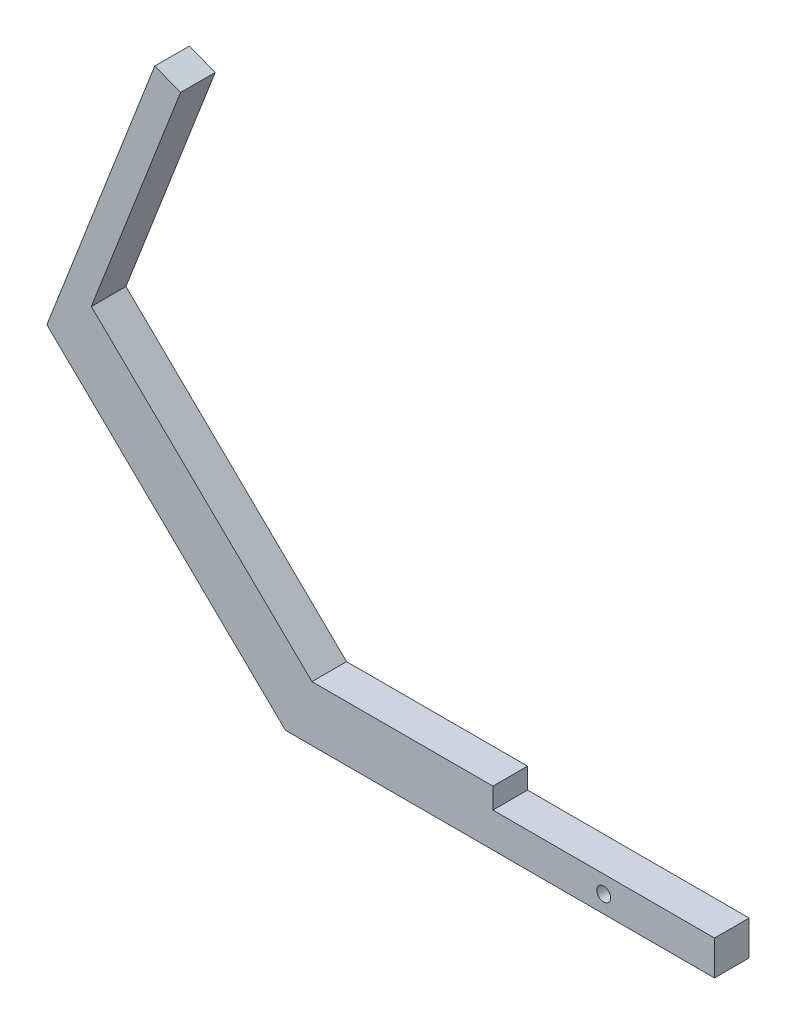
ISO-10303-21;
HEADER;
FILE_DESCRIPTION(('STEP AP214'),'2;1');
FILE_NAME('part.step','',(''),(''),'','','');
FILE_SCHEMA(('AUTOMOTIVE_DESIGN { 1 0 10303 214 1 1 1 1 }'));
ENDSEC;
DATA;
#1=APPLICATION_CONTEXT('core data for automotive mechanical design processes');
#2=APPLICATION_PROTOCOL_DEFINITION('international standard','automotive_design',2000,#1);
#3=PRODUCT_CONTEXT('',#1,'mechanical');
#4=PRODUCT('Part','Part','',(#3));
#5=PRODUCT_RELATED_PRODUCT_CATEGORY('part','',(#4));
#6=PRODUCT_DEFINITION_FORMATION('','',#4);
#7=PRODUCT_DEFINITION_CONTEXT('part definition',#1,'design');
#8=PRODUCT_DEFINITION('design','',#6,#7);
#9=PRODUCT_DEFINITION_SHAPE('','',#8);
#10=(LENGTH_UNIT() NAMED_UNIT(*) SI_UNIT(.MILLI.,.METRE.));
#11=(NAMED_UNIT(*) PLANE_ANGLE_UNIT() SI_UNIT($,.RADIAN.));
#12=(NAMED_UNIT(*) SI_UNIT($,.STERADIAN.) SOLID_ANGLE_UNIT());
#13=UNCERTAINTY_MEASURE_WITH_UNIT(LENGTH_MEASURE(1.E-05),#10,'distance_accuracy_value','');
#14=(GEOMETRIC_REPRESENTATION_CONTEXT(3) GLOBAL_UNCERTAINTY_ASSIGNED_CONTEXT((#13)) GLOBAL_UNIT_ASSIGNED_CONTEXT((#10,
#11,#12)) REPRESENTATION_CONTEXT('',''));
#15=CARTESIAN_POINT('',(0.,0.,0.));
#16=DIRECTION('',(0.,0.,1.));
#17=DIRECTION('',(1.,0.,0.));
#18=AXIS2_PLACEMENT_3D('',#15,#16,#17);
#19=CARTESIAN_POINT('',(0.,0.,25.));
#20=DIRECTION('',(0.,-1.,0.));
#21=DIRECTION('',(1.,0.,0.));
#22=AXIS2_PLACEMENT_3D('',#19,#20,#21);
#23=PLANE('',#22);
#24=DIRECTION('',(-1.,0.,0.));
#25=VECTOR('',#24,1.);
#26=CARTESIAN_POINT('',(0.,0.,0.));
#27=LINE('',#26,#25);
#28=CARTESIAN_POINT('',(0.,0.,0.));
#29=VERTEX_POINT('',#28);
#30=CARTESIAN_POINT('',(-130.675150004258,0.,0.));
#31=VERTEX_POINT('',#30);
#32=EDGE_CURVE('E149',#29,#31,#27,.T.);
#33=ORIENTED_EDGE('',*,*,#32,.T.);
#34=DIRECTION('',(0.,0.,-1.));
#35=VECTOR('',#34,1.);
#36=CARTESIAN_POINT('',(-130.675150004258,0.,25.));
#37=LINE('',#36,#35);
#38=CARTESIAN_POINT('',(-130.675150004258,0.,25.));
#39=VERTEX_POINT('',#38);
#40=EDGE_CURVE('E11',#39,#31,#37,.T.);
#41=ORIENTED_EDGE('',*,*,#40,.F.);
#42=DIRECTION('',(-1.,0.,0.));
#43=VECTOR('',#42,1.);
#44=CARTESIAN_POINT('',(0.,0.,25.));
#45=LINE('',#44,#43);
#46=CARTESIAN_POINT('',(0.,0.,25.));
#47=VERTEX_POINT('',#46);
#48=EDGE_CURVE('E166',#47,#39,#45,.T.);
#49=ORIENTED_EDGE('',*,*,#48,.F.);
#50=DIRECTION('',(0.,0.,-1.));
#51=VECTOR('',#50,1.);
#52=CARTESIAN_POINT('',(0.,0.,25.));
#53=LINE('',#52,#51);
#54=EDGE_CURVE('E148',#47,#29,#53,.T.);
#55=ORIENTED_EDGE('',*,*,#54,.T.);
#56=EDGE_LOOP('',(#33,#41,#49,#55));
#57=FACE_BOUND('',#56,.T.);
#58=ADVANCED_FACE('F41',(#57),#23,.F.);
#59=CARTESIAN_POINT('',(-130.675150004258,0.,25.));
#60=DIRECTION('',(-0.697151273562808,-0.716924055789562,0.));
#61=DIRECTION('',(0.716924055789562,-0.697151273562808,0.));
#62=AXIS2_PLACEMENT_3D('',#59,#60,#61);
#63=PLANE('',#62);
#64=DIRECTION('',(-0.716924055789562,0.697151273562808,0.));
#65=VECTOR('',#64,1.);
#66=CARTESIAN_POINT('',(-130.675150004258,0.,0.));
#67=LINE('',#66,#65);
#68=CARTESIAN_POINT('',(-289.976254660924,154.907576464355,0.));
#69=VERTEX_POINT('',#68);
#70=EDGE_CURVE('E152',#31,#69,#67,.T.);
#71=ORIENTED_EDGE('',*,*,#70,.T.);
#72=DIRECTION('',(0.,0.,-1.));
#73=VECTOR('',#72,1.);
#74=CARTESIAN_POINT('',(-289.976254660924,154.907576464355,25.));
#75=LINE('',#74,#73);
#76=CARTESIAN_POINT('',(-289.976254660924,154.907576464355,25.));
#77=VERTEX_POINT('',#76);
#78=EDGE_CURVE('E48',#77,#69,#75,.T.);
#79=ORIENTED_EDGE('',*,*,#78,.F.);
#80=DIRECTION('',(-0.716924055789562,0.697151273562808,0.));
#81=VECTOR('',#80,1.);
#82=CARTESIAN_POINT('',(-130.675150004258,0.,25.));
#83=LINE('',#82,#81);
#84=EDGE_CURVE('E102',#39,#77,#83,.T.);
#85=ORIENTED_EDGE('',*,*,#84,.F.);
#86=ORIENTED_EDGE('',*,*,#40,.T.);
#87=EDGE_LOOP('',(#71,#79,#85,#86));
#88=FACE_BOUND('',#87,.T.);
#89=ADVANCED_FACE('F231',(#88),#63,.F.);
#90=CARTESIAN_POINT('',(-225.523676842719,320.988184154536,25.));
#91=DIRECTION('',(-0.932259146045215,0.361791216884885,0.));
#92=DIRECTION('',(-0.361791216884885,-0.932259146045215,0.));
#93=AXIS2_PLACEMENT_3D('',#90,#91,#92);
#94=PLANE('',#93);
#95=DIRECTION('',(0.361791216884885,0.932259146045215,0.));
#96=VECTOR('',#95,1.);
#97=CARTESIAN_POINT('',(-225.523676842719,320.988184154536,0.));
#98=LINE('',#97,#96);
#99=CARTESIAN_POINT('',(-225.523676842719,320.988184154536,0.));
#100=VERTEX_POINT('',#99);
#101=EDGE_CURVE('E155',#69,#100,#98,.T.);
#102=ORIENTED_EDGE('',*,*,#101,.T.);
#103=DIRECTION('',(0.,0.,-1.));
#104=VECTOR('',#103,1.);
#105=CARTESIAN_POINT('',(-225.523676842719,320.988184154536,25.));
#106=LINE('',#105,#104);
#107=CARTESIAN_POINT('',(-225.523676842719,320.988184154536,25.));
#108=VERTEX_POINT('',#107);
#109=EDGE_CURVE('E170',#108,#100,#106,.T.);
#110=ORIENTED_EDGE('',*,*,#109,.F.);
#111=DIRECTION('',(0.361791216884885,0.932259146045215,0.));
#112=VECTOR('',#111,1.);
#113=CARTESIAN_POINT('',(-225.523676842719,320.988184154536,25.));
#114=LINE('',#113,#112);
#115=EDGE_CURVE('E178',#77,#108,#114,.T.);
#116=ORIENTED_EDGE('',*,*,#115,.F.);
#117=ORIENTED_EDGE('',*,*,#78,.T.);
#118=EDGE_LOOP('',(#102,#110,#116,#117));
#119=FACE_BOUND('',#118,.T.);
#120=ADVANCED_FACE('F176',(#119),#94,.F.);
#121=CARTESIAN_POINT('',(-244.168859763624,328.224008492234,25.));
#122=DIRECTION('',(-0.361791216884885,-0.932259146045215,0.));
#123=DIRECTION('',(0.932259146045215,-0.361791216884885,0.));
#124=AXIS2_PLACEMENT_3D('',#121,#122,#123);
#125=PLANE('',#124);
#126=DIRECTION('',(-0.932259146045215,0.361791216884885,0.));
#127=VECTOR('',#126,1.);
#128=CARTESIAN_POINT('',(-244.168859763624,328.224008492234,0.));
#129=LINE('',#128,#127);
#130=CARTESIAN_POINT('',(-244.168859763624,328.224008492234,0.));
#131=VERTEX_POINT('',#130);
#132=EDGE_CURVE('E157',#100,#131,#129,.T.);
#133=ORIENTED_EDGE('',*,*,#132,.T.);
#134=DIRECTION('',(0.,0.,-1.));
#135=VECTOR('',#134,1.);
#136=CARTESIAN_POINT('',(-244.168859763624,328.224008492234,25.));
#137=LINE('',#136,#135);
#138=CARTESIAN_POINT('',(-244.168859763624,328.224008492234,25.));
#139=VERTEX_POINT('',#138);
#140=EDGE_CURVE('E136',#139,#131,#137,.T.);
#141=ORIENTED_EDGE('',*,*,#140,.F.);
#142=DIRECTION('',(-0.932259146045215,0.361791216884885,0.));
#143=VECTOR('',#142,1.);
#144=CARTESIAN_POINT('',(-244.168859763624,328.224008492234,25.));
#145=LINE('',#144,#143);
#146=EDGE_CURVE('E124',#108,#139,#145,.T.);
#147=ORIENTED_EDGE('',*,*,#146,.F.);
#148=ORIENTED_EDGE('',*,*,#109,.T.);
#149=EDGE_LOOP('',(#133,#141,#147,#148));
#150=FACE_BOUND('',#149,.T.);
#151=ADVANCED_FACE('F185',(#150),#125,.F.);
#152=CARTESIAN_POINT('',(-322.07294357625,127.481726040137,25.));
#153=DIRECTION('',(0.932259146045215,-0.361791216884885,0.));
#154=DIRECTION('',(0.361791216884885,0.932259146045215,0.));
#155=AXIS2_PLACEMENT_3D('',#152,#153,#154);
#156=PLANE('',#155);
#157=DIRECTION('',(-0.361791216884885,-0.932259146045215,0.));
#158=VECTOR('',#157,1.);
#159=CARTESIAN_POINT('',(-322.07294357625,127.481726040137,0.));
#160=LINE('',#159,#158);
#161=CARTESIAN_POINT('',(-322.07294357625,127.481726040137,0.));
#162=VERTEX_POINT('',#161);
#163=EDGE_CURVE('E133',#131,#162,#160,.T.);
#164=ORIENTED_EDGE('',*,*,#163,.T.);
#165=DIRECTION('',(0.,0.,-1.));
#166=VECTOR('',#165,1.);
#167=CARTESIAN_POINT('',(-322.07294357625,127.481726040137,25.));
#168=LINE('',#167,#166);
#169=CARTESIAN_POINT('',(-322.07294357625,127.481726040137,25.));
#170=VERTEX_POINT('',#169);
#171=EDGE_CURVE('E130',#170,#162,#168,.T.);
#172=ORIENTED_EDGE('',*,*,#171,.F.);
#173=DIRECTION('',(-0.361791216884885,-0.932259146045215,0.));
#174=VECTOR('',#173,1.);
#175=CARTESIAN_POINT('',(-322.07294357625,127.481726040137,25.));
#176=LINE('',#175,#174);
#177=EDGE_CURVE('E115',#139,#170,#176,.T.);
#178=ORIENTED_EDGE('',*,*,#177,.F.);
#179=ORIENTED_EDGE('',*,*,#140,.T.);
#180=EDGE_LOOP('',(#164,#172,#178,#179));
#181=FACE_BOUND('',#180,.T.);
#182=ADVANCED_FACE('F131',(#181),#156,.F.);
#183=CARTESIAN_POINT('',(-149.841058106541,-40.,25.));
#184=DIRECTION('',(0.697151273562808,0.716924055789562,0.));
#185=DIRECTION('',(-0.716924055789562,0.697151273562808,0.));
#186=AXIS2_PLACEMENT_3D('',#183,#184,#185);
#187=PLANE('',#186);
#188=DIRECTION('',(0.716924055789562,-0.697151273562808,0.));
#189=VECTOR('',#188,1.);
#190=CARTESIAN_POINT('',(-149.841058106541,-40.,0.));
#191=LINE('',#190,#189);
#192=CARTESIAN_POINT('',(-149.841058106541,-40.,0.));
#193=VERTEX_POINT('',#192);
#194=EDGE_CURVE('E160',#162,#193,#191,.T.);
#195=ORIENTED_EDGE('',*,*,#194,.T.);
#196=DIRECTION('',(0.,0.,-1.));
#197=VECTOR('',#196,1.);
#198=CARTESIAN_POINT('',(-149.841058106541,-40.,25.));
#199=LINE('',#198,#197);
#200=CARTESIAN_POINT('',(-149.841058106541,-40.,25.));
#201=VERTEX_POINT('',#200);
#202=EDGE_CURVE('E137',#201,#193,#199,.T.);
#203=ORIENTED_EDGE('',*,*,#202,.F.);
#204=DIRECTION('',(0.716924055789562,-0.697151273562808,0.));
#205=VECTOR('',#204,1.);
#206=CARTESIAN_POINT('',(-149.841058106541,-40.,25.));
#207=LINE('',#206,#205);
#208=EDGE_CURVE('E121',#170,#201,#207,.T.);
#209=ORIENTED_EDGE('',*,*,#208,.F.);
#210=ORIENTED_EDGE('',*,*,#171,.T.);
#211=EDGE_LOOP('',(#195,#203,#209,#210));
#212=FACE_BOUND('',#211,.T.);
#213=ADVANCED_FACE('F139',(#212),#187,.F.);
#214=CARTESIAN_POINT('',(0.,-40.,25.));
#215=DIRECTION('',(0.,1.,0.));
#216=DIRECTION('',(-1.,0.,0.));
#217=AXIS2_PLACEMENT_3D('',#214,#215,#216);
#218=PLANE('',#217);
#219=DIRECTION('',(1.,0.,0.));
#220=VECTOR('',#219,1.);
#221=CARTESIAN_POINT('',(0.,-40.,0.));
#222=LINE('',#221,#220);
#223=CARTESIAN_POINT('',(160.,-40.,0.));
#224=VERTEX_POINT('',#223);
#225=EDGE_CURVE('E162',#193,#224,#222,.T.);
#226=ORIENTED_EDGE('',*,*,#225,.T.);
#227=DIRECTION('',(0.,0.,-1.));
#228=VECTOR('',#227,1.);
#229=CARTESIAN_POINT('',(160.,-40.,25.));
#230=LINE('',#229,#228);
#231=CARTESIAN_POINT('',(160.,-40.,25.));
#232=VERTEX_POINT('',#231);
#233=EDGE_CURVE('E192',#232,#224,#230,.T.);
#234=ORIENTED_EDGE('',*,*,#233,.F.);
#235=DIRECTION('',(1.,0.,0.));
#236=VECTOR('',#235,1.);
#237=CARTESIAN_POINT('',(0.,-40.,25.));
#238=LINE('',#237,#236);
#239=EDGE_CURVE('E142',#201,#232,#238,.T.);
#240=ORIENTED_EDGE('',*,*,#239,.F.);
#241=ORIENTED_EDGE('',*,*,#202,.T.);
#242=EDGE_LOOP('',(#226,#234,#240,#241));
#243=FACE_BOUND('',#242,.T.);
#244=ADVANCED_FACE('F251',(#243),#218,.F.);
#245=CARTESIAN_POINT('',(0.,0.,25.));
#246=DIRECTION('',(-1.,0.,0.));
#247=DIRECTION('',(0.,-1.,0.));
#248=AXIS2_PLACEMENT_3D('',#245,#246,#247);
#249=PLANE('',#248);
#250=DIRECTION('',(0.,1.,0.));
#251=VECTOR('',#250,1.);
#252=CARTESIAN_POINT('',(0.,0.,25.));
#253=LINE('',#252,#251);
#254=CARTESIAN_POINT('',(0.,-15.,25.));
#255=VERTEX_POINT('',#254);
#256=EDGE_CURVE('E64',#255,#47,#253,.T.);
#257=ORIENTED_EDGE('',*,*,#256,.F.);
#258=DIRECTION('',(0.,0.,-1.));
#259=VECTOR('',#258,1.);
#260=CARTESIAN_POINT('',(0.,-15.,25.));
#261=LINE('',#260,#259);
#262=CARTESIAN_POINT('',(0.,-15.,0.));
#263=VERTEX_POINT('',#262);
#264=EDGE_CURVE('E153',#255,#263,#261,.T.);
#265=ORIENTED_EDGE('',*,*,#264,.T.);
#266=DIRECTION('',(0.,1.,0.));
#267=VECTOR('',#266,1.);
#268=CARTESIAN_POINT('',(0.,0.,0.));
#269=LINE('',#268,#267);
#270=EDGE_CURVE('E94',#263,#29,#269,.T.);
#271=ORIENTED_EDGE('',*,*,#270,.T.);
#272=ORIENTED_EDGE('',*,*,#54,.F.);
#273=EDGE_LOOP('',(#257,#265,#271,#272));
#274=FACE_BOUND('',#273,.T.);
#275=ADVANCED_FACE('F227',(#274),#249,.F.);
#276=CARTESIAN_POINT('',(0.,0.,25.));
#277=DIRECTION('',(0.,0.,1.));
#278=DIRECTION('',(1.,0.,0.));
#279=AXIS2_PLACEMENT_3D('',#276,#277,#278);
#280=PLANE('',#279);
#281=ORIENTED_EDGE('',*,*,#48,.T.);
#282=ORIENTED_EDGE('',*,*,#84,.T.);
#283=ORIENTED_EDGE('',*,*,#115,.T.);
#284=ORIENTED_EDGE('',*,*,#146,.T.);
#285=ORIENTED_EDGE('',*,*,#177,.T.);
#286=ORIENTED_EDGE('',*,*,#208,.T.);
#287=ORIENTED_EDGE('',*,*,#239,.T.);
#288=DIRECTION('',(0.,-1.,0.));
#289=VECTOR('',#288,1.);
#290=CARTESIAN_POINT('',(160.,0.,25.));
#291=LINE('',#290,#289);
#292=CARTESIAN_POINT('',(160.,-15.,25.));
#293=VERTEX_POINT('',#292);
#294=EDGE_CURVE('E193',#293,#232,#291,.T.);
#295=ORIENTED_EDGE('',*,*,#294,.F.);
#296=DIRECTION('',(1.,0.,0.));
#297=VECTOR('',#296,1.);
#298=CARTESIAN_POINT('',(0.,-15.,25.));
#299=LINE('',#298,#297);
#300=EDGE_CURVE('E207',#255,#293,#299,.T.);
#301=ORIENTED_EDGE('',*,*,#300,.F.);
#302=ORIENTED_EDGE('',*,*,#256,.T.);
#303=EDGE_LOOP('',(#281,#282,#283,#284,#285,#286,#287,#295,#301,#302));
#304=FACE_BOUND('',#303,.T.);
#305=CARTESIAN_POINT('',(80.,-27.5,25.));
#306=DIRECTION('',(0.,0.,-1.));
#307=DIRECTION('',(-1.,0.,0.));
#308=AXIS2_PLACEMENT_3D('',#305,#306,#307);
#309=CIRCLE('',#308,5.);
#310=CARTESIAN_POINT('',(75.,-27.5,25.));
#311=VERTEX_POINT('',#310);
#312=EDGE_CURVE('E200',#311,#311,#309,.T.);
#313=ORIENTED_EDGE('',*,*,#312,.T.);
#314=EDGE_LOOP('',(#313));
#315=FACE_BOUND('',#314,.T.);
#316=ADVANCED_FACE('F117',(#304,#315),#280,.T.);
#317=CARTESIAN_POINT('',(0.,0.,0.));
#318=DIRECTION('',(0.,0.,1.));
#319=DIRECTION('',(1.,0.,0.));
#320=AXIS2_PLACEMENT_3D('',#317,#318,#319);
#321=PLANE('',#320);
#322=ORIENTED_EDGE('',*,*,#32,.F.);
#323=ORIENTED_EDGE('',*,*,#270,.F.);
#324=DIRECTION('',(1.,0.,0.));
#325=VECTOR('',#324,1.);
#326=CARTESIAN_POINT('',(0.,-15.,0.));
#327=LINE('',#326,#325);
#328=CARTESIAN_POINT('',(160.,-15.,0.));
#329=VERTEX_POINT('',#328);
#330=EDGE_CURVE('E55',#263,#329,#327,.T.);
#331=ORIENTED_EDGE('',*,*,#330,.T.);
#332=DIRECTION('',(0.,-1.,0.));
#333=VECTOR('',#332,1.);
#334=CARTESIAN_POINT('',(160.,0.,0.));
#335=LINE('',#334,#333);
#336=EDGE_CURVE('E197',#329,#224,#335,.T.);
#337=ORIENTED_EDGE('',*,*,#336,.T.);
#338=ORIENTED_EDGE('',*,*,#225,.F.);
#339=ORIENTED_EDGE('',*,*,#194,.F.);
#340=ORIENTED_EDGE('',*,*,#163,.F.);
#341=ORIENTED_EDGE('',*,*,#132,.F.);
#342=ORIENTED_EDGE('',*,*,#101,.F.);
#343=ORIENTED_EDGE('',*,*,#70,.F.);
#344=EDGE_LOOP('',(#322,#323,#331,#337,#338,#339,#340,#341,#342,#343));
#345=FACE_BOUND('',#344,.T.);
#346=CARTESIAN_POINT('',(80.,-27.5,0.));
#347=DIRECTION('',(0.,0.,-1.));
#348=DIRECTION('',(-1.,0.,0.));
#349=AXIS2_PLACEMENT_3D('',#346,#347,#348);
#350=CIRCLE('',#349,5.);
#351=CARTESIAN_POINT('',(75.,-27.5,0.));
#352=VERTEX_POINT('',#351);
#353=EDGE_CURVE('E202',#352,#352,#350,.T.);
#354=ORIENTED_EDGE('',*,*,#353,.F.);
#355=EDGE_LOOP('',(#354));
#356=FACE_BOUND('',#355,.T.);
#357=ADVANCED_FACE('F182',(#345,#356),#321,.F.);
#358=CARTESIAN_POINT('',(0.,-15.,25.));
#359=DIRECTION('',(0.,1.,0.));
#360=DIRECTION('',(-1.,0.,0.));
#361=AXIS2_PLACEMENT_3D('',#358,#359,#360);
#362=PLANE('',#361);
#363=ORIENTED_EDGE('',*,*,#330,.F.);
#364=ORIENTED_EDGE('',*,*,#264,.F.);
#365=ORIENTED_EDGE('',*,*,#300,.T.);
#366=DIRECTION('',(0.,0.,-1.));
#367=VECTOR('',#366,1.);
#368=CARTESIAN_POINT('',(160.,-15.,25.));
#369=LINE('',#368,#367);
#370=EDGE_CURVE('E190',#293,#329,#369,.T.);
#371=ORIENTED_EDGE('',*,*,#370,.T.);
#372=EDGE_LOOP('',(#363,#364,#365,#371));
#373=FACE_BOUND('',#372,.T.);
#374=ADVANCED_FACE('F217',(#373),#362,.T.);
#375=CARTESIAN_POINT('',(80.,-27.5,25.));
#376=DIRECTION('',(0.,0.,-1.));
#377=DIRECTION('',(-1.,0.,0.));
#378=AXIS2_PLACEMENT_3D('',#375,#376,#377);
#379=CYLINDRICAL_SURFACE('',#378,5.);
#380=ORIENTED_EDGE('',*,*,#312,.F.);
#381=EDGE_LOOP('',(#380));
#382=FACE_BOUND('',#381,.T.);
#383=ORIENTED_EDGE('',*,*,#353,.T.);
#384=EDGE_LOOP('',(#383));
#385=FACE_BOUND('',#384,.T.);
#386=ADVANCED_FACE('F213',(#382,#385),#379,.F.);
#387=CARTESIAN_POINT('',(160.,0.,25.));
#388=DIRECTION('',(1.,0.,0.));
#389=DIRECTION('',(0.,0.,-1.));
#390=AXIS2_PLACEMENT_3D('',#387,#388,#389);
#391=PLANE('',#390);
#392=ORIENTED_EDGE('',*,*,#336,.F.);
#393=ORIENTED_EDGE('',*,*,#370,.F.);
#394=ORIENTED_EDGE('',*,*,#294,.T.);
#395=ORIENTED_EDGE('',*,*,#233,.T.);
#396=EDGE_LOOP('',(#392,#393,#394,#395));
#397=FACE_BOUND('',#396,.T.);
#398=ADVANCED_FACE('F216',(#397),#391,.T.);
#399=CLOSED_SHELL('',(#58,#89,#120,#151,#182,#213,#244,#275,#316,#357,#374,#386,#398));
#400=MANIFOLD_SOLID_BREP('B2',#399);
#401=ADVANCED_BREP_SHAPE_REPRESENTATION('',(#18,#400),#14);
#402=SHAPE_DEFINITION_REPRESENTATION(#9,#401);
ENDSEC;
END-ISO-10303-21;
